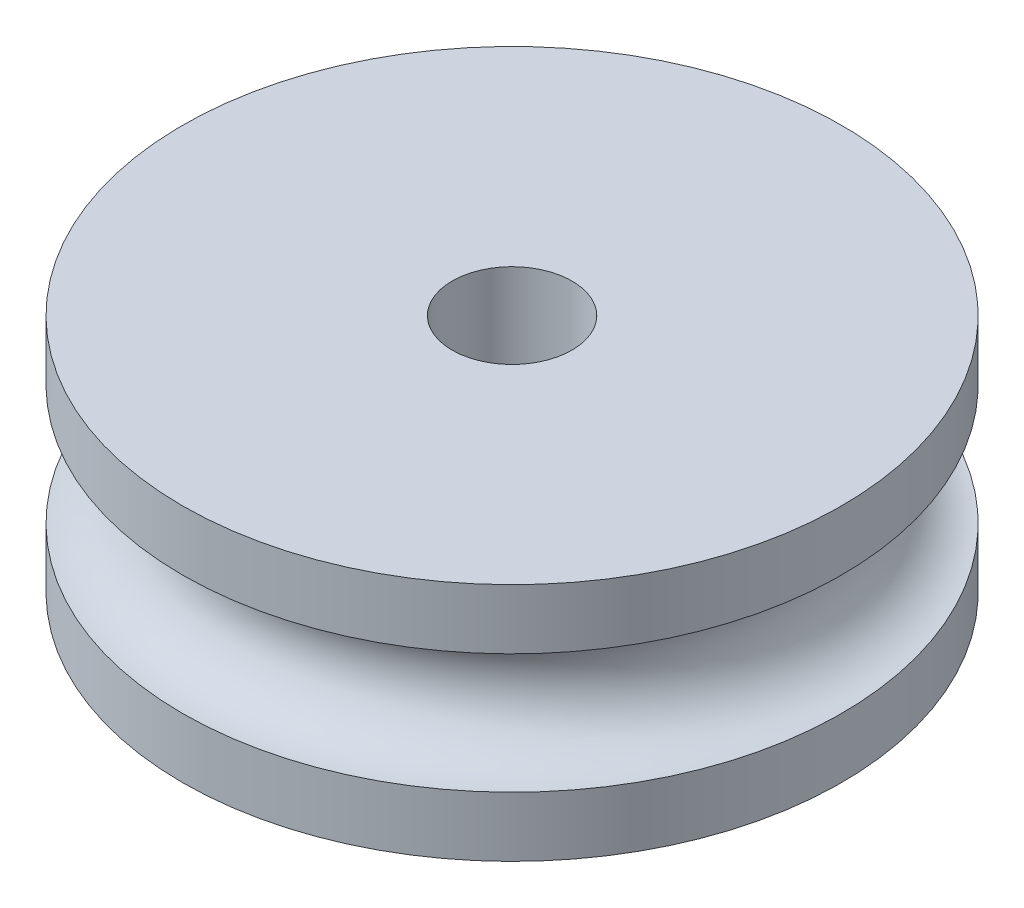
ISO-10303-21;
HEADER;
FILE_DESCRIPTION(('STEP AP214'),'2;1');
FILE_NAME('part.step','',(''),(''),'','','');
FILE_SCHEMA(('AUTOMOTIVE_DESIGN { 1 0 10303 214 1 1 1 1 }'));
ENDSEC;
DATA;
#1=APPLICATION_CONTEXT('core data for automotive mechanical design processes');
#2=APPLICATION_PROTOCOL_DEFINITION('international standard','automotive_design',2000,#1);
#3=PRODUCT_CONTEXT('',#1,'mechanical');
#4=PRODUCT('Part','Part','',(#3));
#5=PRODUCT_RELATED_PRODUCT_CATEGORY('part','',(#4));
#6=PRODUCT_DEFINITION_FORMATION('','',#4);
#7=PRODUCT_DEFINITION_CONTEXT('part definition',#1,'design');
#8=PRODUCT_DEFINITION('design','',#6,#7);
#9=PRODUCT_DEFINITION_SHAPE('','',#8);
#10=(LENGTH_UNIT() NAMED_UNIT(*) SI_UNIT(.MILLI.,.METRE.));
#11=(NAMED_UNIT(*) PLANE_ANGLE_UNIT() SI_UNIT($,.RADIAN.));
#12=(NAMED_UNIT(*) SI_UNIT($,.STERADIAN.) SOLID_ANGLE_UNIT());
#13=UNCERTAINTY_MEASURE_WITH_UNIT(LENGTH_MEASURE(1.E-05),#10,'distance_accuracy_value','');
#14=(GEOMETRIC_REPRESENTATION_CONTEXT(3) GLOBAL_UNCERTAINTY_ASSIGNED_CONTEXT((#13)) GLOBAL_UNIT_ASSIGNED_CONTEXT((#10,
#11,#12)) REPRESENTATION_CONTEXT('',''));
#15=CARTESIAN_POINT('',(0.,0.,0.));
#16=DIRECTION('',(0.,0.,1.));
#17=DIRECTION('',(1.,0.,0.));
#18=AXIS2_PLACEMENT_3D('',#15,#16,#17);
#19=CARTESIAN_POINT('',(76.5,54.52643198464,-44.43));
#20=DIRECTION('',(0.,1.,0.));
#21=DIRECTION('',(0.,0.,1.));
#22=AXIS2_PLACEMENT_3D('',#19,#20,#21);
#23=PLANE('',#22);
#24=CARTESIAN_POINT('',(75.5,54.52643198464,-44.43));
#25=DIRECTION('',(0.,1.,0.));
#26=DIRECTION('',(0.,0.,1.));
#27=AXIS2_PLACEMENT_3D('',#24,#25,#26);
#28=CIRCLE('',#27,5.50000000000001);
#29=CARTESIAN_POINT('',(75.5,54.52643198464,-38.93));
#30=VERTEX_POINT('',#29);
#31=EDGE_CURVE('E64',#30,#30,#28,.T.);
#32=ORIENTED_EDGE('',*,*,#31,.T.);
#33=EDGE_LOOP('',(#32));
#34=FACE_BOUND('',#33,.T.);
#35=CARTESIAN_POINT('',(75.5,54.52643198464,-44.43));
#36=DIRECTION('',(0.,1.,0.));
#37=DIRECTION('',(0.,0.,1.));
#38=AXIS2_PLACEMENT_3D('',#35,#36,#37);
#39=CIRCLE('',#38,1.);
#40=CARTESIAN_POINT('',(75.5,54.52643198464,-43.43));
#41=VERTEX_POINT('',#40);
#42=EDGE_CURVE('E10',#41,#41,#39,.T.);
#43=ORIENTED_EDGE('',*,*,#42,.F.);
#44=EDGE_LOOP('',(#43));
#45=FACE_BOUND('',#44,.T.);
#46=ADVANCED_FACE('F37',(#34,#45),#23,.T.);
#47=CARTESIAN_POINT('',(75.5,50.52643198464,-44.43));
#48=DIRECTION('',(0.,1.,0.));
#49=DIRECTION('',(0.,0.,1.));
#50=AXIS2_PLACEMENT_3D('',#47,#48,#49);
#51=CYLINDRICAL_SURFACE('',#50,1.);
#52=ORIENTED_EDGE('',*,*,#42,.T.);
#53=EDGE_LOOP('',(#52));
#54=FACE_BOUND('',#53,.T.);
#55=CARTESIAN_POINT('',(75.5,50.52643198464,-44.43));
#56=DIRECTION('',(0.,1.,0.));
#57=DIRECTION('',(0.,0.,1.));
#58=AXIS2_PLACEMENT_3D('',#55,#56,#57);
#59=CIRCLE('',#58,1.);
#60=CARTESIAN_POINT('',(75.5,50.52643198464,-43.43));
#61=VERTEX_POINT('',#60);
#62=EDGE_CURVE('E44',#61,#61,#59,.T.);
#63=ORIENTED_EDGE('',*,*,#62,.F.);
#64=EDGE_LOOP('',(#63));
#65=FACE_BOUND('',#64,.T.);
#66=ADVANCED_FACE('F83',(#54,#65),#51,.F.);
#67=CARTESIAN_POINT('',(81.,50.52643198464,-44.43));
#68=DIRECTION('',(0.,-1.,0.));
#69=DIRECTION('',(0.,0.,-1.));
#70=AXIS2_PLACEMENT_3D('',#67,#68,#69);
#71=PLANE('',#70);
#72=ORIENTED_EDGE('',*,*,#62,.T.);
#73=EDGE_LOOP('',(#72));
#74=FACE_BOUND('',#73,.T.);
#75=CARTESIAN_POINT('',(75.5,50.52643198464,-44.43));
#76=DIRECTION('',(0.,1.,0.));
#77=DIRECTION('',(0.,0.,1.));
#78=AXIS2_PLACEMENT_3D('',#75,#76,#77);
#79=CIRCLE('',#78,5.50000000000001);
#80=CARTESIAN_POINT('',(75.5,50.52643198464,-38.93));
#81=VERTEX_POINT('',#80);
#82=EDGE_CURVE('E49',#81,#81,#79,.T.);
#83=ORIENTED_EDGE('',*,*,#82,.F.);
#84=EDGE_LOOP('',(#83));
#85=FACE_BOUND('',#84,.T.);
#86=ADVANCED_FACE('F87',(#74,#85),#71,.T.);
#87=CARTESIAN_POINT('',(75.5,50.52643198464,-44.43));
#88=DIRECTION('',(0.,1.,0.));
#89=DIRECTION('',(0.,0.,1.));
#90=AXIS2_PLACEMENT_3D('',#87,#88,#89);
#91=CYLINDRICAL_SURFACE('',#90,5.50000000000001);
#92=ORIENTED_EDGE('',*,*,#82,.T.);
#93=EDGE_LOOP('',(#92));
#94=FACE_BOUND('',#93,.T.);
#95=CARTESIAN_POINT('',(75.5,51.52643198464,-44.43));
#96=DIRECTION('',(0.,1.,0.));
#97=DIRECTION('',(0.,0.,1.));
#98=AXIS2_PLACEMENT_3D('',#95,#96,#97);
#99=CIRCLE('',#98,5.50000000000001);
#100=CARTESIAN_POINT('',(75.5,51.52643198464,-38.93));
#101=VERTEX_POINT('',#100);
#102=EDGE_CURVE('E54',#101,#101,#99,.T.);
#103=ORIENTED_EDGE('',*,*,#102,.F.);
#104=EDGE_LOOP('',(#103));
#105=FACE_BOUND('',#104,.T.);
#106=ADVANCED_FACE('F79',(#94,#105),#91,.T.);
#107=CARTESIAN_POINT('',(75.5,52.52643198464,-44.43));
#108=DIRECTION('',(0.,1.,0.));
#109=DIRECTION('',(0.,0.,1.));
#110=AXIS2_PLACEMENT_3D('',#107,#108,#109);
#111=TOROIDAL_SURFACE('',#110,5.50000000000001,0.999999999999997);
#112=ORIENTED_EDGE('',*,*,#102,.T.);
#113=EDGE_LOOP('',(#112));
#114=FACE_BOUND('',#113,.T.);
#115=CARTESIAN_POINT('',(75.5,53.52643198464,-44.43));
#116=DIRECTION('',(0.,1.,0.));
#117=DIRECTION('',(0.,0.,1.));
#118=AXIS2_PLACEMENT_3D('',#115,#116,#117);
#119=CIRCLE('',#118,5.50000000000001);
#120=CARTESIAN_POINT('',(75.5,53.52643198464,-38.93));
#121=VERTEX_POINT('',#120);
#122=EDGE_CURVE('E60',#121,#121,#119,.T.);
#123=ORIENTED_EDGE('',*,*,#122,.F.);
#124=EDGE_LOOP('',(#123));
#125=FACE_BOUND('',#124,.T.);
#126=ADVANCED_FACE('F73',(#114,#125),#111,.F.);
#127=CARTESIAN_POINT('',(75.5,50.52643198464,-44.43));
#128=DIRECTION('',(0.,1.,0.));
#129=DIRECTION('',(0.,0.,1.));
#130=AXIS2_PLACEMENT_3D('',#127,#128,#129);
#131=CYLINDRICAL_SURFACE('',#130,5.50000000000001);
#132=ORIENTED_EDGE('',*,*,#122,.T.);
#133=EDGE_LOOP('',(#132));
#134=FACE_BOUND('',#133,.T.);
#135=ORIENTED_EDGE('',*,*,#31,.F.);
#136=EDGE_LOOP('',(#135));
#137=FACE_BOUND('',#136,.T.);
#138=ADVANCED_FACE('F71',(#134,#137),#131,.T.);
#139=CLOSED_SHELL('',(#46,#66,#86,#106,#126,#138));
#140=MANIFOLD_SOLID_BREP('B2',#139);
#141=ADVANCED_BREP_SHAPE_REPRESENTATION('',(#18,#140),#14);
#142=SHAPE_DEFINITION_REPRESENTATION(#9,#141);
ENDSEC;
END-ISO-10303-21;
